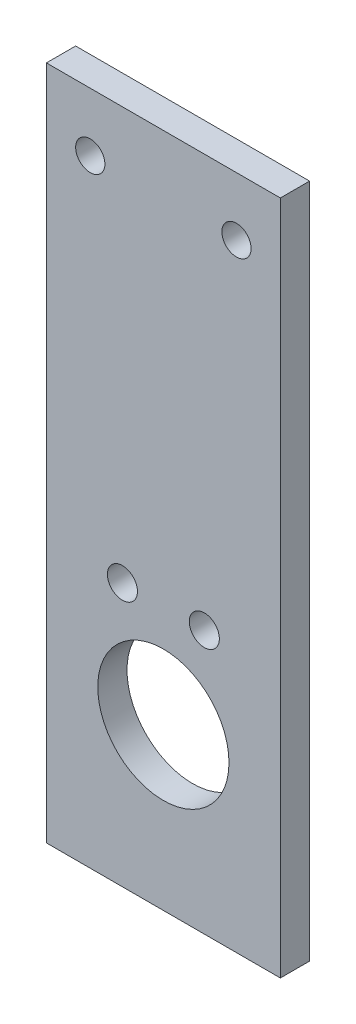
ISO-10303-21;
HEADER;
FILE_DESCRIPTION(('STEP AP214'),'2;1');
FILE_NAME('part.step','',(''),(''),'','','');
FILE_SCHEMA(('AUTOMOTIVE_DESIGN { 1 0 10303 214 1 1 1 1 }'));
ENDSEC;
DATA;
#1=APPLICATION_CONTEXT('core data for automotive mechanical design processes');
#2=APPLICATION_PROTOCOL_DEFINITION('international standard','automotive_design',2000,#1);
#3=PRODUCT_CONTEXT('',#1,'mechanical');
#4=PRODUCT('Part','Part','',(#3));
#5=PRODUCT_RELATED_PRODUCT_CATEGORY('part','',(#4));
#6=PRODUCT_DEFINITION_FORMATION('','',#4);
#7=PRODUCT_DEFINITION_CONTEXT('part definition',#1,'design');
#8=PRODUCT_DEFINITION('design','',#6,#7);
#9=PRODUCT_DEFINITION_SHAPE('','',#8);
#10=(LENGTH_UNIT() NAMED_UNIT(*) SI_UNIT(.MILLI.,.METRE.));
#11=(NAMED_UNIT(*) PLANE_ANGLE_UNIT() SI_UNIT($,.RADIAN.));
#12=(NAMED_UNIT(*) SI_UNIT($,.STERADIAN.) SOLID_ANGLE_UNIT());
#13=UNCERTAINTY_MEASURE_WITH_UNIT(LENGTH_MEASURE(1.E-05),#10,'distance_accuracy_value','');
#14=(GEOMETRIC_REPRESENTATION_CONTEXT(3) GLOBAL_UNCERTAINTY_ASSIGNED_CONTEXT((#13)) GLOBAL_UNIT_ASSIGNED_CONTEXT((#10,
#11,#12)) REPRESENTATION_CONTEXT('',''));
#15=CARTESIAN_POINT('',(0.,0.,0.));
#16=DIRECTION('',(0.,0.,1.));
#17=DIRECTION('',(1.,0.,0.));
#18=AXIS2_PLACEMENT_3D('',#15,#16,#17);
#19=CARTESIAN_POINT('',(0.,0.,6.35));
#20=DIRECTION('',(0.,0.,1.));
#21=DIRECTION('',(1.,0.,0.));
#22=AXIS2_PLACEMENT_3D('',#19,#20,#21);
#23=PLANE('',#22);
#24=CARTESIAN_POINT('',(8.89000000000011,-89.535,6.35));
#25=DIRECTION('',(0.,0.,1.));
#26=DIRECTION('',(1.,0.,0.));
#27=AXIS2_PLACEMENT_3D('',#24,#25,#26);
#28=CIRCLE('',#27,3.26389999999999);
#29=CARTESIAN_POINT('',(12.1539000000001,-89.535,6.35));
#30=VERTEX_POINT('',#29);
#31=EDGE_CURVE('E150',#30,#30,#28,.T.);
#32=ORIENTED_EDGE('',*,*,#31,.F.);
#33=EDGE_LOOP('',(#32));
#34=FACE_BOUND('',#33,.T.);
#35=CARTESIAN_POINT('',(-8.88999999999989,-89.535,6.35));
#36=DIRECTION('',(0.,0.,1.));
#37=DIRECTION('',(1.,0.,0.));
#38=AXIS2_PLACEMENT_3D('',#35,#36,#37);
#39=CIRCLE('',#38,3.2639);
#40=CARTESIAN_POINT('',(-5.62609999999989,-89.535,6.35));
#41=VERTEX_POINT('',#40);
#42=EDGE_CURVE('E147',#41,#41,#39,.T.);
#43=ORIENTED_EDGE('',*,*,#42,.F.);
#44=EDGE_LOOP('',(#43));
#45=FACE_BOUND('',#44,.T.);
#46=CARTESIAN_POINT('',(-15.875,-12.7,6.35));
#47=DIRECTION('',(0.,0.,1.));
#48=DIRECTION('',(1.,0.,0.));
#49=AXIS2_PLACEMENT_3D('',#46,#47,#48);
#50=CIRCLE('',#49,3.175);
#51=CARTESIAN_POINT('',(-12.7,-12.7,6.35));
#52=VERTEX_POINT('',#51);
#53=EDGE_CURVE('E129',#52,#52,#50,.T.);
#54=ORIENTED_EDGE('',*,*,#53,.F.);
#55=EDGE_LOOP('',(#54));
#56=FACE_BOUND('',#55,.T.);
#57=DIRECTION('',(0.,-1.,0.));
#58=VECTOR('',#57,1.);
#59=CARTESIAN_POINT('',(-25.4,0.,6.35));
#60=LINE('',#59,#58);
#61=CARTESIAN_POINT('',(-25.4,0.,6.35));
#62=VERTEX_POINT('',#61);
#63=CARTESIAN_POINT('',(-25.4,-146.685,6.35));
#64=VERTEX_POINT('',#63);
#65=EDGE_CURVE('E99',#62,#64,#60,.T.);
#66=ORIENTED_EDGE('',*,*,#65,.T.);
#67=DIRECTION('',(1.,0.,0.));
#68=VECTOR('',#67,1.);
#69=CARTESIAN_POINT('',(-25.4,-146.685,6.35));
#70=LINE('',#69,#68);
#71=CARTESIAN_POINT('',(25.4,-146.685,6.35));
#72=VERTEX_POINT('',#71);
#73=EDGE_CURVE('E94',#64,#72,#70,.T.);
#74=ORIENTED_EDGE('',*,*,#73,.T.);
#75=DIRECTION('',(0.,1.,0.));
#76=VECTOR('',#75,1.);
#77=CARTESIAN_POINT('',(25.4,0.,6.35));
#78=LINE('',#77,#76);
#79=CARTESIAN_POINT('',(25.4,0.,6.35));
#80=VERTEX_POINT('',#79);
#81=EDGE_CURVE('E97',#72,#80,#78,.T.);
#82=ORIENTED_EDGE('',*,*,#81,.T.);
#83=DIRECTION('',(-1.,0.,0.));
#84=VECTOR('',#83,1.);
#85=CARTESIAN_POINT('',(-25.4,0.,6.35));
#86=LINE('',#85,#84);
#87=EDGE_CURVE('E64',#80,#62,#86,.T.);
#88=ORIENTED_EDGE('',*,*,#87,.T.);
#89=EDGE_LOOP('',(#66,#74,#82,#88));
#90=FACE_BOUND('',#89,.T.);
#91=CARTESIAN_POINT('',(0.,-111.76,6.35));
#92=DIRECTION('',(0.,0.,1.));
#93=DIRECTION('',(1.,0.,0.));
#94=AXIS2_PLACEMENT_3D('',#91,#92,#93);
#95=CIRCLE('',#94,14.2494);
#96=CARTESIAN_POINT('',(14.2494,-111.76,6.35));
#97=VERTEX_POINT('',#96);
#98=EDGE_CURVE('E114',#97,#97,#95,.T.);
#99=ORIENTED_EDGE('',*,*,#98,.F.);
#100=EDGE_LOOP('',(#99));
#101=FACE_BOUND('',#100,.T.);
#102=CARTESIAN_POINT('',(15.875,-12.7,6.35));
#103=DIRECTION('',(0.,0.,1.));
#104=DIRECTION('',(1.,0.,0.));
#105=AXIS2_PLACEMENT_3D('',#102,#103,#104);
#106=CIRCLE('',#105,3.175);
#107=CARTESIAN_POINT('',(19.05,-12.7,6.35));
#108=VERTEX_POINT('',#107);
#109=EDGE_CURVE('E135',#108,#108,#106,.T.);
#110=ORIENTED_EDGE('',*,*,#109,.F.);
#111=EDGE_LOOP('',(#110));
#112=FACE_BOUND('',#111,.T.);
#113=ADVANCED_FACE('F47',(#34,#45,#56,#90,#101,#112),#23,.T.);
#114=CARTESIAN_POINT('',(0.,0.,0.));
#115=DIRECTION('',(0.,0.,1.));
#116=DIRECTION('',(1.,0.,0.));
#117=AXIS2_PLACEMENT_3D('',#114,#115,#116);
#118=PLANE('',#117);
#119=CARTESIAN_POINT('',(8.89000000000011,-89.535,0.));
#120=DIRECTION('',(0.,0.,1.));
#121=DIRECTION('',(1.,0.,0.));
#122=AXIS2_PLACEMENT_3D('',#119,#120,#121);
#123=CIRCLE('',#122,3.26389999999999);
#124=CARTESIAN_POINT('',(12.1539000000001,-89.535,0.));
#125=VERTEX_POINT('',#124);
#126=EDGE_CURVE('E141',#125,#125,#123,.T.);
#127=ORIENTED_EDGE('',*,*,#126,.T.);
#128=EDGE_LOOP('',(#127));
#129=FACE_BOUND('',#128,.T.);
#130=CARTESIAN_POINT('',(-8.88999999999989,-89.535,0.));
#131=DIRECTION('',(0.,0.,1.));
#132=DIRECTION('',(1.,0.,0.));
#133=AXIS2_PLACEMENT_3D('',#130,#131,#132);
#134=CIRCLE('',#133,3.2639);
#135=CARTESIAN_POINT('',(-5.62609999999989,-89.535,0.));
#136=VERTEX_POINT('',#135);
#137=EDGE_CURVE('E144',#136,#136,#134,.T.);
#138=ORIENTED_EDGE('',*,*,#137,.T.);
#139=EDGE_LOOP('',(#138));
#140=FACE_BOUND('',#139,.T.);
#141=DIRECTION('',(0.,-1.,0.));
#142=VECTOR('',#141,1.);
#143=CARTESIAN_POINT('',(-25.4,0.,0.));
#144=LINE('',#143,#142);
#145=CARTESIAN_POINT('',(-25.4,0.,0.));
#146=VERTEX_POINT('',#145);
#147=CARTESIAN_POINT('',(-25.4,-146.685,0.));
#148=VERTEX_POINT('',#147);
#149=EDGE_CURVE('E111',#146,#148,#144,.T.);
#150=ORIENTED_EDGE('',*,*,#149,.F.);
#151=DIRECTION('',(-1.,0.,0.));
#152=VECTOR('',#151,1.);
#153=CARTESIAN_POINT('',(-25.4,0.,0.));
#154=LINE('',#153,#152);
#155=CARTESIAN_POINT('',(25.4,0.,0.));
#156=VERTEX_POINT('',#155);
#157=EDGE_CURVE('E87',#156,#146,#154,.T.);
#158=ORIENTED_EDGE('',*,*,#157,.F.);
#159=DIRECTION('',(0.,1.,0.));
#160=VECTOR('',#159,1.);
#161=CARTESIAN_POINT('',(25.4,0.,0.));
#162=LINE('',#161,#160);
#163=CARTESIAN_POINT('',(25.4,-146.685,0.));
#164=VERTEX_POINT('',#163);
#165=EDGE_CURVE('E81',#164,#156,#162,.T.);
#166=ORIENTED_EDGE('',*,*,#165,.F.);
#167=DIRECTION('',(1.,0.,0.));
#168=VECTOR('',#167,1.);
#169=CARTESIAN_POINT('',(-25.4,-146.685,0.));
#170=LINE('',#169,#168);
#171=EDGE_CURVE('E103',#148,#164,#170,.T.);
#172=ORIENTED_EDGE('',*,*,#171,.F.);
#173=EDGE_LOOP('',(#150,#158,#166,#172));
#174=FACE_BOUND('',#173,.T.);
#175=CARTESIAN_POINT('',(0.,-111.76,0.));
#176=DIRECTION('',(0.,0.,1.));
#177=DIRECTION('',(1.,0.,0.));
#178=AXIS2_PLACEMENT_3D('',#175,#176,#177);
#179=CIRCLE('',#178,14.2494);
#180=CARTESIAN_POINT('',(14.2494,-111.76,0.));
#181=VERTEX_POINT('',#180);
#182=EDGE_CURVE('E126',#181,#181,#179,.T.);
#183=ORIENTED_EDGE('',*,*,#182,.T.);
#184=EDGE_LOOP('',(#183));
#185=FACE_BOUND('',#184,.T.);
#186=CARTESIAN_POINT('',(-15.875,-12.7,0.));
#187=DIRECTION('',(0.,0.,1.));
#188=DIRECTION('',(1.,0.,0.));
#189=AXIS2_PLACEMENT_3D('',#186,#187,#188);
#190=CIRCLE('',#189,3.175);
#191=CARTESIAN_POINT('',(-12.7,-12.7,0.));
#192=VERTEX_POINT('',#191);
#193=EDGE_CURVE('E132',#192,#192,#190,.T.);
#194=ORIENTED_EDGE('',*,*,#193,.T.);
#195=EDGE_LOOP('',(#194));
#196=FACE_BOUND('',#195,.T.);
#197=CARTESIAN_POINT('',(15.875,-12.7,0.));
#198=DIRECTION('',(0.,0.,1.));
#199=DIRECTION('',(1.,0.,0.));
#200=AXIS2_PLACEMENT_3D('',#197,#198,#199);
#201=CIRCLE('',#200,3.175);
#202=CARTESIAN_POINT('',(19.05,-12.7,0.));
#203=VERTEX_POINT('',#202);
#204=EDGE_CURVE('E138',#203,#203,#201,.T.);
#205=ORIENTED_EDGE('',*,*,#204,.T.);
#206=EDGE_LOOP('',(#205));
#207=FACE_BOUND('',#206,.T.);
#208=ADVANCED_FACE('F122',(#129,#140,#174,#185,#196,#207),#118,.F.);
#209=CARTESIAN_POINT('',(-25.4,0.,6.35));
#210=DIRECTION('',(1.,0.,0.));
#211=DIRECTION('',(0.,1.,0.));
#212=AXIS2_PLACEMENT_3D('',#209,#210,#211);
#213=PLANE('',#212);
#214=ORIENTED_EDGE('',*,*,#149,.T.);
#215=DIRECTION('',(0.,0.,-1.));
#216=VECTOR('',#215,1.);
#217=CARTESIAN_POINT('',(-25.4,-146.685,6.35));
#218=LINE('',#217,#216);
#219=EDGE_CURVE('E11',#64,#148,#218,.T.);
#220=ORIENTED_EDGE('',*,*,#219,.F.);
#221=ORIENTED_EDGE('',*,*,#65,.F.);
#222=DIRECTION('',(0.,0.,-1.));
#223=VECTOR('',#222,1.);
#224=CARTESIAN_POINT('',(-25.4,0.,6.35));
#225=LINE('',#224,#223);
#226=EDGE_CURVE('E107',#62,#146,#225,.T.);
#227=ORIENTED_EDGE('',*,*,#226,.T.);
#228=EDGE_LOOP('',(#214,#220,#221,#227));
#229=FACE_BOUND('',#228,.T.);
#230=ADVANCED_FACE('F49',(#229),#213,.F.);
#231=CARTESIAN_POINT('',(-25.4,-146.685,6.35));
#232=DIRECTION('',(0.,1.,0.));
#233=DIRECTION('',(0.,0.,1.));
#234=AXIS2_PLACEMENT_3D('',#231,#232,#233);
#235=PLANE('',#234);
#236=ORIENTED_EDGE('',*,*,#171,.T.);
#237=DIRECTION('',(0.,0.,-1.));
#238=VECTOR('',#237,1.);
#239=CARTESIAN_POINT('',(25.4,-146.685,6.35));
#240=LINE('',#239,#238);
#241=EDGE_CURVE('E56',#72,#164,#240,.T.);
#242=ORIENTED_EDGE('',*,*,#241,.F.);
#243=ORIENTED_EDGE('',*,*,#73,.F.);
#244=ORIENTED_EDGE('',*,*,#219,.T.);
#245=EDGE_LOOP('',(#236,#242,#243,#244));
#246=FACE_BOUND('',#245,.T.);
#247=ADVANCED_FACE('F102',(#246),#235,.F.);
#248=CARTESIAN_POINT('',(25.4,0.,6.35));
#249=DIRECTION('',(-1.,0.,0.));
#250=DIRECTION('',(0.,-1.,0.));
#251=AXIS2_PLACEMENT_3D('',#248,#249,#250);
#252=PLANE('',#251);
#253=ORIENTED_EDGE('',*,*,#165,.T.);
#254=DIRECTION('',(0.,0.,-1.));
#255=VECTOR('',#254,1.);
#256=CARTESIAN_POINT('',(25.4,0.,6.35));
#257=LINE('',#256,#255);
#258=EDGE_CURVE('E104',#80,#156,#257,.T.);
#259=ORIENTED_EDGE('',*,*,#258,.F.);
#260=ORIENTED_EDGE('',*,*,#81,.F.);
#261=ORIENTED_EDGE('',*,*,#241,.T.);
#262=EDGE_LOOP('',(#253,#259,#260,#261));
#263=FACE_BOUND('',#262,.T.);
#264=ADVANCED_FACE('F105',(#263),#252,.F.);
#265=CARTESIAN_POINT('',(-25.4,0.,6.35));
#266=DIRECTION('',(0.,-1.,0.));
#267=DIRECTION('',(0.,0.,-1.));
#268=AXIS2_PLACEMENT_3D('',#265,#266,#267);
#269=PLANE('',#268);
#270=ORIENTED_EDGE('',*,*,#157,.T.);
#271=ORIENTED_EDGE('',*,*,#226,.F.);
#272=ORIENTED_EDGE('',*,*,#87,.F.);
#273=ORIENTED_EDGE('',*,*,#258,.T.);
#274=EDGE_LOOP('',(#270,#271,#272,#273));
#275=FACE_BOUND('',#274,.T.);
#276=ADVANCED_FACE('F119',(#275),#269,.F.);
#277=CARTESIAN_POINT('',(0.,-111.76,6.35));
#278=DIRECTION('',(0.,0.,-1.));
#279=DIRECTION('',(-1.,0.,0.));
#280=AXIS2_PLACEMENT_3D('',#277,#278,#279);
#281=CYLINDRICAL_SURFACE('',#280,14.2494);
#282=ORIENTED_EDGE('',*,*,#98,.T.);
#283=EDGE_LOOP('',(#282));
#284=FACE_BOUND('',#283,.T.);
#285=ORIENTED_EDGE('',*,*,#182,.F.);
#286=EDGE_LOOP('',(#285));
#287=FACE_BOUND('',#286,.T.);
#288=ADVANCED_FACE('F176',(#284,#287),#281,.F.);
#289=CARTESIAN_POINT('',(-15.875,-12.7,6.35));
#290=DIRECTION('',(0.,0.,-1.));
#291=DIRECTION('',(-1.,0.,0.));
#292=AXIS2_PLACEMENT_3D('',#289,#290,#291);
#293=CYLINDRICAL_SURFACE('',#292,3.175);
#294=ORIENTED_EDGE('',*,*,#53,.T.);
#295=EDGE_LOOP('',(#294));
#296=FACE_BOUND('',#295,.T.);
#297=ORIENTED_EDGE('',*,*,#193,.F.);
#298=EDGE_LOOP('',(#297));
#299=FACE_BOUND('',#298,.T.);
#300=ADVANCED_FACE('F172',(#296,#299),#293,.F.);
#301=CARTESIAN_POINT('',(15.875,-12.7,6.35));
#302=DIRECTION('',(0.,0.,-1.));
#303=DIRECTION('',(-1.,0.,0.));
#304=AXIS2_PLACEMENT_3D('',#301,#302,#303);
#305=CYLINDRICAL_SURFACE('',#304,3.175);
#306=ORIENTED_EDGE('',*,*,#109,.T.);
#307=EDGE_LOOP('',(#306));
#308=FACE_BOUND('',#307,.T.);
#309=ORIENTED_EDGE('',*,*,#204,.F.);
#310=EDGE_LOOP('',(#309));
#311=FACE_BOUND('',#310,.T.);
#312=ADVANCED_FACE('F175',(#308,#311),#305,.F.);
#313=CARTESIAN_POINT('',(-8.88999999999989,-89.535,0.));
#314=DIRECTION('',(0.,0.,1.));
#315=DIRECTION('',(1.,0.,0.));
#316=AXIS2_PLACEMENT_3D('',#313,#314,#315);
#317=CYLINDRICAL_SURFACE('',#316,3.2639);
#318=ORIENTED_EDGE('',*,*,#137,.F.);
#319=EDGE_LOOP('',(#318));
#320=FACE_BOUND('',#319,.T.);
#321=ORIENTED_EDGE('',*,*,#42,.T.);
#322=EDGE_LOOP('',(#321));
#323=FACE_BOUND('',#322,.T.);
#324=ADVANCED_FACE('F161',(#320,#323),#317,.F.);
#325=CARTESIAN_POINT('',(8.89000000000011,-89.535,0.));
#326=DIRECTION('',(0.,0.,1.));
#327=DIRECTION('',(1.,0.,0.));
#328=AXIS2_PLACEMENT_3D('',#325,#326,#327);
#329=CYLINDRICAL_SURFACE('',#328,3.26389999999999);
#330=ORIENTED_EDGE('',*,*,#126,.F.);
#331=EDGE_LOOP('',(#330));
#332=FACE_BOUND('',#331,.T.);
#333=ORIENTED_EDGE('',*,*,#31,.T.);
#334=EDGE_LOOP('',(#333));
#335=FACE_BOUND('',#334,.T.);
#336=ADVANCED_FACE('F158',(#332,#335),#329,.F.);
#337=CLOSED_SHELL('',(#113,#208,#230,#247,#264,#276,#288,#300,#312,#324,#336));
#338=MANIFOLD_SOLID_BREP('B2',#337);
#339=ADVANCED_BREP_SHAPE_REPRESENTATION('',(#18,#338),#14);
#340=SHAPE_DEFINITION_REPRESENTATION(#9,#339);
ENDSEC;
END-ISO-10303-21;
